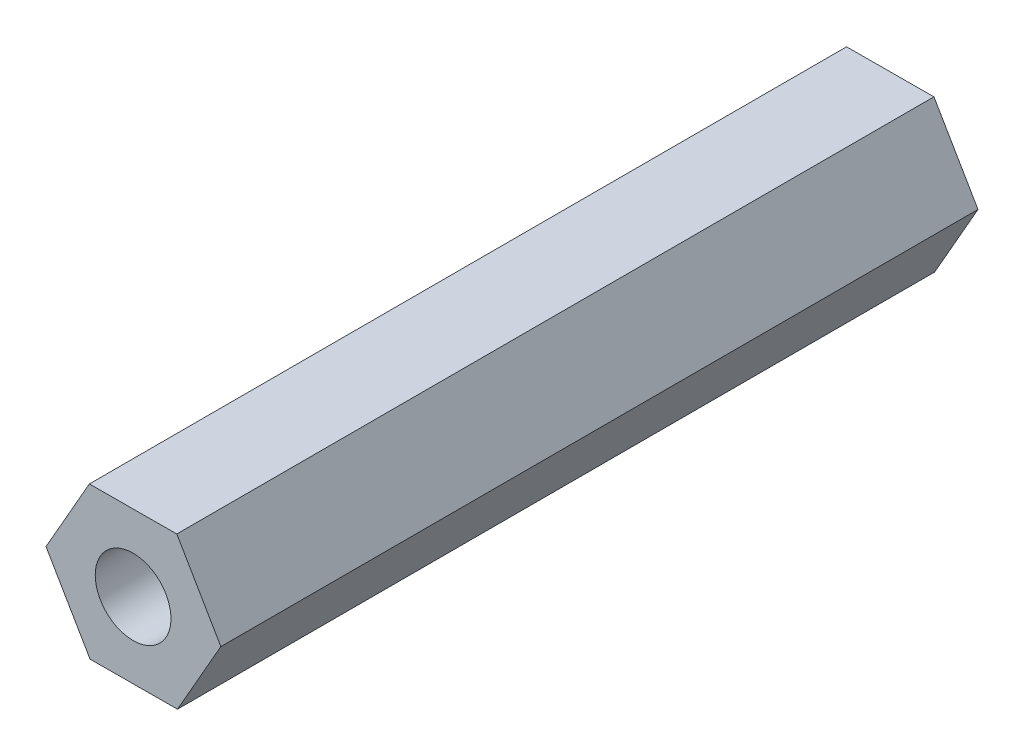
ISO-10303-21;
HEADER;
FILE_DESCRIPTION(('STEP AP214'),'2;1');
FILE_NAME('part.step','',(''),(''),'','','');
FILE_SCHEMA(('AUTOMOTIVE_DESIGN { 1 0 10303 214 1 1 1 1 }'));
ENDSEC;
DATA;
#1=APPLICATION_CONTEXT('core data for automotive mechanical design processes');
#2=APPLICATION_PROTOCOL_DEFINITION('international standard','automotive_design',2000,#1);
#3=PRODUCT_CONTEXT('',#1,'mechanical');
#4=PRODUCT('Part','Part','',(#3));
#5=PRODUCT_RELATED_PRODUCT_CATEGORY('part','',(#4));
#6=PRODUCT_DEFINITION_FORMATION('','',#4);
#7=PRODUCT_DEFINITION_CONTEXT('part definition',#1,'design');
#8=PRODUCT_DEFINITION('design','',#6,#7);
#9=PRODUCT_DEFINITION_SHAPE('','',#8);
#10=(LENGTH_UNIT() NAMED_UNIT(*) SI_UNIT(.MILLI.,.METRE.));
#11=(NAMED_UNIT(*) PLANE_ANGLE_UNIT() SI_UNIT($,.RADIAN.));
#12=(NAMED_UNIT(*) SI_UNIT($,.STERADIAN.) SOLID_ANGLE_UNIT());
#13=UNCERTAINTY_MEASURE_WITH_UNIT(LENGTH_MEASURE(1.E-05),#10,'distance_accuracy_value','');
#14=(GEOMETRIC_REPRESENTATION_CONTEXT(3) GLOBAL_UNCERTAINTY_ASSIGNED_CONTEXT((#13)) GLOBAL_UNIT_ASSIGNED_CONTEXT((#10,
#11,#12)) REPRESENTATION_CONTEXT('',''));
#15=CARTESIAN_POINT('',(0.,0.,0.));
#16=DIRECTION('',(0.,0.,1.));
#17=DIRECTION('',(1.,0.,0.));
#18=AXIS2_PLACEMENT_3D('',#15,#16,#17);
#19=CARTESIAN_POINT('',(-69.7440908169541,15.1559622259267,25.));
#20=DIRECTION('',(-0.00447565788556396,0.999989984193087,0.));
#21=DIRECTION('',(-0.999989984193087,-0.00447565788556396,0.));
#22=AXIS2_PLACEMENT_3D('',#19,#20,#21);
#23=PLANE('',#22);
#24=DIRECTION('',(0.999989984193087,0.00447565788556396,0.));
#25=VECTOR('',#24,1.);
#26=CARTESIAN_POINT('',(-69.7440908169541,15.1559622259267,0.));
#27=LINE('',#26,#25);
#28=CARTESIAN_POINT('',(-69.7440908169541,15.1559622259267,0.));
#29=VERTEX_POINT('',#28);
#30=CARTESIAN_POINT('',(-66.85736838415,15.1688823373519,0.));
#31=VERTEX_POINT('',#30);
#32=EDGE_CURVE('E121',#29,#31,#27,.T.);
#33=ORIENTED_EDGE('',*,*,#32,.T.);
#34=DIRECTION('',(0.,0.,-1.));
#35=VECTOR('',#34,1.);
#36=CARTESIAN_POINT('',(-66.85736838415,15.1688823373519,25.));
#37=LINE('',#36,#35);
#38=CARTESIAN_POINT('',(-66.85736838415,15.1688823373519,25.));
#39=VERTEX_POINT('',#38);
#40=EDGE_CURVE('E11',#39,#31,#37,.T.);
#41=ORIENTED_EDGE('',*,*,#40,.F.);
#42=DIRECTION('',(0.999989984193087,0.00447565788556396,0.));
#43=VECTOR('',#42,1.);
#44=CARTESIAN_POINT('',(-69.7440908169541,15.1559622259267,25.));
#45=LINE('',#44,#43);
#46=CARTESIAN_POINT('',(-69.7440908169541,15.1559622259267,25.));
#47=VERTEX_POINT('',#46);
#48=EDGE_CURVE('E132',#47,#39,#45,.T.);
#49=ORIENTED_EDGE('',*,*,#48,.F.);
#50=DIRECTION('',(0.,0.,-1.));
#51=VECTOR('',#50,1.);
#52=CARTESIAN_POINT('',(-69.7440908169541,15.1559622259267,25.));
#53=LINE('',#52,#51);
#54=EDGE_CURVE('E117',#47,#29,#53,.T.);
#55=ORIENTED_EDGE('',*,*,#54,.T.);
#56=EDGE_LOOP('',(#33,#41,#49,#55));
#57=FACE_BOUND('',#56,.T.);
#58=ADVANCED_FACE('F37',(#57),#23,.F.);
#59=CARTESIAN_POINT('',(-66.85736838415,15.1688823373519,25.));
#60=DIRECTION('',(-0.868254558783996,0.496118958668996,0.));
#61=DIRECTION('',(-0.496118958668996,-0.868254558783996,0.));
#62=AXIS2_PLACEMENT_3D('',#59,#60,#61);
#63=PLANE('',#62);
#64=DIRECTION('',(0.496118958668996,0.868254558783995,0.));
#65=VECTOR('',#64,1.);
#66=CARTESIAN_POINT('',(-66.85736838415,15.1688823373519,0.));
#67=LINE('',#66,#65);
#68=CARTESIAN_POINT('',(-65.4251963124619,17.6753173535472,0.));
#69=VERTEX_POINT('',#68);
#70=EDGE_CURVE('E124',#31,#69,#67,.T.);
#71=ORIENTED_EDGE('',*,*,#70,.T.);
#72=DIRECTION('',(0.,0.,-1.));
#73=VECTOR('',#72,1.);
#74=CARTESIAN_POINT('',(-65.4251963124619,17.6753173535472,25.));
#75=LINE('',#74,#73);
#76=CARTESIAN_POINT('',(-65.4251963124619,17.6753173535472,25.));
#77=VERTEX_POINT('',#76);
#78=EDGE_CURVE('E45',#77,#69,#75,.T.);
#79=ORIENTED_EDGE('',*,*,#78,.F.);
#80=DIRECTION('',(0.496118958668996,0.868254558783995,0.));
#81=VECTOR('',#80,1.);
#82=CARTESIAN_POINT('',(-66.85736838415,15.1688823373519,25.));
#83=LINE('',#82,#81);
#84=EDGE_CURVE('E90',#39,#77,#83,.T.);
#85=ORIENTED_EDGE('',*,*,#84,.F.);
#86=ORIENTED_EDGE('',*,*,#40,.T.);
#87=EDGE_LOOP('',(#71,#79,#85,#86));
#88=FACE_BOUND('',#87,.T.);
#89=ADVANCED_FACE('F157',(#88),#63,.F.);
#90=CARTESIAN_POINT('',(-65.4251963124619,17.6753173535472,25.));
#91=DIRECTION('',(-0.863778900898434,-0.503871025524086,0.));
#92=DIRECTION('',(0.503871025524086,-0.863778900898434,0.));
#93=AXIS2_PLACEMENT_3D('',#90,#91,#92);
#94=PLANE('',#93);
#95=DIRECTION('',(-0.503871025524086,0.863778900898434,0.));
#96=VECTOR('',#95,1.);
#97=CARTESIAN_POINT('',(-65.4251963124619,17.6753173535472,0.));
#98=LINE('',#97,#96);
#99=CARTESIAN_POINT('',(-66.8797466735779,20.1688322583173,0.));
#100=VERTEX_POINT('',#99);
#101=EDGE_CURVE('E127',#69,#100,#98,.T.);
#102=ORIENTED_EDGE('',*,*,#101,.T.);
#103=DIRECTION('',(0.,0.,-1.));
#104=VECTOR('',#103,1.);
#105=CARTESIAN_POINT('',(-66.8797466735779,20.1688322583173,25.));
#106=LINE('',#105,#104);
#107=CARTESIAN_POINT('',(-66.8797466735779,20.1688322583173,25.));
#108=VERTEX_POINT('',#107);
#109=EDGE_CURVE('E112',#108,#100,#106,.T.);
#110=ORIENTED_EDGE('',*,*,#109,.F.);
#111=DIRECTION('',(-0.503871025524086,0.863778900898434,0.));
#112=VECTOR('',#111,1.);
#113=CARTESIAN_POINT('',(-65.4251963124619,17.6753173535472,25.));
#114=LINE('',#113,#112);
#115=EDGE_CURVE('E103',#77,#108,#114,.T.);
#116=ORIENTED_EDGE('',*,*,#115,.F.);
#117=ORIENTED_EDGE('',*,*,#78,.T.);
#118=EDGE_LOOP('',(#102,#110,#116,#117));
#119=FACE_BOUND('',#118,.T.);
#120=ADVANCED_FACE('F138',(#119),#94,.F.);
#121=CARTESIAN_POINT('',(-66.8797466735779,20.1688322583173,25.));
#122=DIRECTION('',(0.00447565788556338,-0.999989984193088,0.));
#123=DIRECTION('',(0.999989984193088,0.00447565788556338,0.));
#124=AXIS2_PLACEMENT_3D('',#121,#122,#123);
#125=PLANE('',#124);
#126=DIRECTION('',(-0.999989984193087,-0.00447565788556338,0.));
#127=VECTOR('',#126,1.);
#128=CARTESIAN_POINT('',(-66.8797466735779,20.1688322583173,0.));
#129=LINE('',#128,#127);
#130=CARTESIAN_POINT('',(-69.7664691063819,20.1559121468922,0.));
#131=VERTEX_POINT('',#130);
#132=EDGE_CURVE('E111',#100,#131,#129,.T.);
#133=ORIENTED_EDGE('',*,*,#132,.T.);
#134=DIRECTION('',(0.,0.,-1.));
#135=VECTOR('',#134,1.);
#136=CARTESIAN_POINT('',(-69.7664691063819,20.1559121468922,25.));
#137=LINE('',#136,#135);
#138=CARTESIAN_POINT('',(-69.7664691063819,20.1559121468922,25.));
#139=VERTEX_POINT('',#138);
#140=EDGE_CURVE('E108',#139,#131,#137,.T.);
#141=ORIENTED_EDGE('',*,*,#140,.F.);
#142=DIRECTION('',(-0.999989984193087,-0.00447565788556338,0.));
#143=VECTOR('',#142,1.);
#144=CARTESIAN_POINT('',(-66.8797466735779,20.1688322583173,25.));
#145=LINE('',#144,#143);
#146=EDGE_CURVE('E97',#108,#139,#145,.T.);
#147=ORIENTED_EDGE('',*,*,#146,.F.);
#148=ORIENTED_EDGE('',*,*,#109,.T.);
#149=EDGE_LOOP('',(#133,#141,#147,#148));
#150=FACE_BOUND('',#149,.T.);
#151=ADVANCED_FACE('F109',(#150),#125,.F.);
#152=CARTESIAN_POINT('',(-69.7664691063819,20.1559121468922,25.));
#153=DIRECTION('',(0.868254558783993,-0.496118958669001,0.));
#154=DIRECTION('',(0.496118958669001,0.868254558783993,0.));
#155=AXIS2_PLACEMENT_3D('',#152,#153,#154);
#156=PLANE('',#155);
#157=DIRECTION('',(-0.496118958669001,-0.868254558783993,0.));
#158=VECTOR('',#157,1.);
#159=CARTESIAN_POINT('',(-69.7664691063819,20.1559121468922,0.));
#160=LINE('',#159,#158);
#161=CARTESIAN_POINT('',(-71.19864117807,17.6494771306969,0.));
#162=VERTEX_POINT('',#161);
#163=EDGE_CURVE('E76',#131,#162,#160,.T.);
#164=ORIENTED_EDGE('',*,*,#163,.T.);
#165=DIRECTION('',(0.,0.,-1.));
#166=VECTOR('',#165,1.);
#167=CARTESIAN_POINT('',(-71.19864117807,17.6494771306969,25.));
#168=LINE('',#167,#166);
#169=CARTESIAN_POINT('',(-71.19864117807,17.6494771306969,25.));
#170=VERTEX_POINT('',#169);
#171=EDGE_CURVE('E113',#170,#162,#168,.T.);
#172=ORIENTED_EDGE('',*,*,#171,.F.);
#173=DIRECTION('',(-0.496118958669001,-0.868254558783993,0.));
#174=VECTOR('',#173,1.);
#175=CARTESIAN_POINT('',(-69.7664691063819,20.1559121468922,25.));
#176=LINE('',#175,#174);
#177=EDGE_CURVE('E101',#139,#170,#176,.T.);
#178=ORIENTED_EDGE('',*,*,#177,.F.);
#179=ORIENTED_EDGE('',*,*,#140,.T.);
#180=EDGE_LOOP('',(#164,#172,#178,#179));
#181=FACE_BOUND('',#180,.T.);
#182=ADVANCED_FACE('F115',(#181),#156,.F.);
#183=CARTESIAN_POINT('',(-71.19864117807,17.6494771306969,25.));
#184=DIRECTION('',(0.86377890089843,0.503871025524092,0.));
#185=DIRECTION('',(-0.503871025524092,0.86377890089843,0.));
#186=AXIS2_PLACEMENT_3D('',#183,#184,#185);
#187=PLANE('',#186);
#188=DIRECTION('',(0.503871025524092,-0.86377890089843,0.));
#189=VECTOR('',#188,1.);
#190=CARTESIAN_POINT('',(-71.19864117807,17.6494771306969,0.));
#191=LINE('',#190,#189);
#192=EDGE_CURVE('E82',#162,#29,#191,.T.);
#193=ORIENTED_EDGE('',*,*,#192,.T.);
#194=ORIENTED_EDGE('',*,*,#54,.F.);
#195=DIRECTION('',(0.503871025524092,-0.86377890089843,0.));
#196=VECTOR('',#195,1.);
#197=CARTESIAN_POINT('',(-71.19864117807,17.6494771306969,25.));
#198=LINE('',#197,#196);
#199=EDGE_CURVE('E53',#170,#47,#198,.T.);
#200=ORIENTED_EDGE('',*,*,#199,.F.);
#201=ORIENTED_EDGE('',*,*,#171,.T.);
#202=EDGE_LOOP('',(#193,#194,#200,#201));
#203=FACE_BOUND('',#202,.T.);
#204=ADVANCED_FACE('F145',(#203),#187,.F.);
#205=CARTESIAN_POINT('',(0.,0.,25.));
#206=DIRECTION('',(0.,0.,1.));
#207=DIRECTION('',(1.,0.,0.));
#208=AXIS2_PLACEMENT_3D('',#205,#206,#207);
#209=PLANE('',#208);
#210=CARTESIAN_POINT('',(-68.3231078899799,17.6494771306969,25.));
#211=DIRECTION('',(0.,0.,-1.));
#212=DIRECTION('',(-1.,0.,0.));
#213=AXIS2_PLACEMENT_3D('',#210,#211,#212);
#214=CIRCLE('',#213,1.25);
#215=CARTESIAN_POINT('',(-69.5731078899799,17.6494771306969,25.));
#216=VERTEX_POINT('',#215);
#217=EDGE_CURVE('E125',#216,#216,#214,.T.);
#218=ORIENTED_EDGE('',*,*,#217,.T.);
#219=EDGE_LOOP('',(#218));
#220=FACE_BOUND('',#219,.T.);
#221=ORIENTED_EDGE('',*,*,#48,.T.);
#222=ORIENTED_EDGE('',*,*,#84,.T.);
#223=ORIENTED_EDGE('',*,*,#115,.T.);
#224=ORIENTED_EDGE('',*,*,#146,.T.);
#225=ORIENTED_EDGE('',*,*,#177,.T.);
#226=ORIENTED_EDGE('',*,*,#199,.T.);
#227=EDGE_LOOP('',(#221,#222,#223,#224,#225,#226));
#228=FACE_BOUND('',#227,.T.);
#229=ADVANCED_FACE('F99',(#220,#228),#209,.T.);
#230=CARTESIAN_POINT('',(0.,0.,0.));
#231=DIRECTION('',(0.,0.,1.));
#232=DIRECTION('',(1.,0.,0.));
#233=AXIS2_PLACEMENT_3D('',#230,#231,#232);
#234=PLANE('',#233);
#235=CARTESIAN_POINT('',(-68.3231078899799,17.6494771306969,0.));
#236=DIRECTION('',(0.,0.,-1.));
#237=DIRECTION('',(-1.,0.,0.));
#238=AXIS2_PLACEMENT_3D('',#235,#236,#237);
#239=CIRCLE('',#238,1.25);
#240=CARTESIAN_POINT('',(-69.5731078899799,17.6494771306969,0.));
#241=VERTEX_POINT('',#240);
#242=EDGE_CURVE('E244',#241,#241,#239,.T.);
#243=ORIENTED_EDGE('',*,*,#242,.F.);
#244=EDGE_LOOP('',(#243));
#245=FACE_BOUND('',#244,.T.);
#246=ORIENTED_EDGE('',*,*,#32,.F.);
#247=ORIENTED_EDGE('',*,*,#192,.F.);
#248=ORIENTED_EDGE('',*,*,#163,.F.);
#249=ORIENTED_EDGE('',*,*,#132,.F.);
#250=ORIENTED_EDGE('',*,*,#101,.F.);
#251=ORIENTED_EDGE('',*,*,#70,.F.);
#252=EDGE_LOOP('',(#246,#247,#248,#249,#250,#251));
#253=FACE_BOUND('',#252,.T.);
#254=ADVANCED_FACE('F141',(#245,#253),#234,.F.);
#255=CARTESIAN_POINT('',(-68.3231078899799,17.6494771306969,25.));
#256=DIRECTION('',(0.,0.,-1.));
#257=DIRECTION('',(-1.,0.,0.));
#258=AXIS2_PLACEMENT_3D('',#255,#256,#257);
#259=CYLINDRICAL_SURFACE('',#258,1.25);
#260=ORIENTED_EDGE('',*,*,#217,.F.);
#261=EDGE_LOOP('',(#260));
#262=FACE_BOUND('',#261,.T.);
#263=ORIENTED_EDGE('',*,*,#242,.T.);
#264=EDGE_LOOP('',(#263));
#265=FACE_BOUND('',#264,.T.);
#266=ADVANCED_FACE('F197',(#262,#265),#259,.F.);
#267=CLOSED_SHELL('',(#58,#89,#120,#151,#182,#204,#229,#254,#266));
#268=MANIFOLD_SOLID_BREP('B2',#267);
#269=ADVANCED_BREP_SHAPE_REPRESENTATION('',(#18,#268),#14);
#270=SHAPE_DEFINITION_REPRESENTATION(#9,#269);
ENDSEC;
END-ISO-10303-21;
